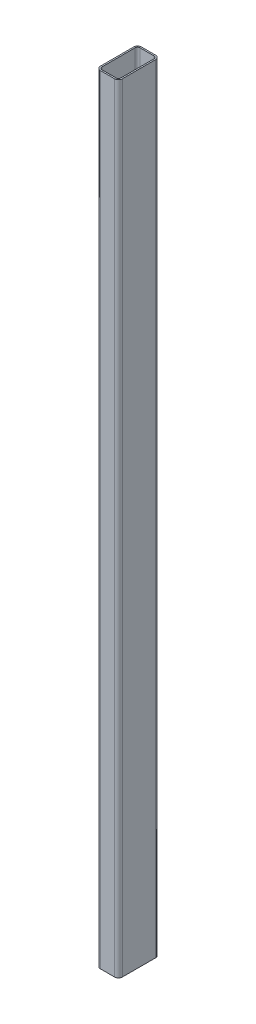
ISO-10303-21;
HEADER;
FILE_DESCRIPTION(('STEP AP214'),'2;1');
FILE_NAME('part.step','',(''),(''),'','','');
FILE_SCHEMA(('AUTOMOTIVE_DESIGN { 1 0 10303 214 1 1 1 1 }'));
ENDSEC;
DATA;
#1=APPLICATION_CONTEXT('core data for automotive mechanical design processes');
#2=APPLICATION_PROTOCOL_DEFINITION('international standard','automotive_design',2000,#1);
#3=PRODUCT_CONTEXT('',#1,'mechanical');
#4=PRODUCT('Part','Part','',(#3));
#5=PRODUCT_RELATED_PRODUCT_CATEGORY('part','',(#4));
#6=PRODUCT_DEFINITION_FORMATION('','',#4);
#7=PRODUCT_DEFINITION_CONTEXT('part definition',#1,'design');
#8=PRODUCT_DEFINITION('design','',#6,#7);
#9=PRODUCT_DEFINITION_SHAPE('','',#8);
#10=(LENGTH_UNIT() NAMED_UNIT(*) SI_UNIT(.MILLI.,.METRE.));
#11=(NAMED_UNIT(*) PLANE_ANGLE_UNIT() SI_UNIT($,.RADIAN.));
#12=(NAMED_UNIT(*) SI_UNIT($,.STERADIAN.) SOLID_ANGLE_UNIT());
#13=UNCERTAINTY_MEASURE_WITH_UNIT(LENGTH_MEASURE(1.E-05),#10,'distance_accuracy_value','');
#14=(GEOMETRIC_REPRESENTATION_CONTEXT(3) GLOBAL_UNCERTAINTY_ASSIGNED_CONTEXT((#13)) GLOBAL_UNIT_ASSIGNED_CONTEXT((#10,
#11,#12)) REPRESENTATION_CONTEXT('',''));
#15=CARTESIAN_POINT('',(0.,0.,0.));
#16=DIRECTION('',(0.,0.,1.));
#17=DIRECTION('',(1.,0.,0.));
#18=AXIS2_PLACEMENT_3D('',#15,#16,#17);
#19=CARTESIAN_POINT('',(-15.,1634.,35.));
#20=DIRECTION('',(0.,1.,0.));
#21=DIRECTION('',(0.,0.,1.));
#22=AXIS2_PLACEMENT_3D('',#19,#20,#21);
#23=PLANE('',#22);
#24=CARTESIAN_POINT('',(-15.,1634.,35.));
#25=DIRECTION('',(0.,1.,0.));
#26=DIRECTION('',(1.,0.,0.));
#27=AXIS2_PLACEMENT_3D('',#24,#25,#26);
#28=CIRCLE('',#27,8.);
#29=CARTESIAN_POINT('',(-23.,1634.,35.));
#30=VERTEX_POINT('',#29);
#31=CARTESIAN_POINT('',(-15.,1634.,43.));
#32=VERTEX_POINT('',#31);
#33=EDGE_CURVE('E261',#30,#32,#28,.T.);
#34=ORIENTED_EDGE('',*,*,#33,.T.);
#35=DIRECTION('',(1.,0.,0.));
#36=VECTOR('',#35,1.);
#37=CARTESIAN_POINT('',(-15.,1634.,43.));
#38=LINE('',#37,#36);
#39=CARTESIAN_POINT('',(15.,1634.,43.));
#40=VERTEX_POINT('',#39);
#41=EDGE_CURVE('E264',#32,#40,#38,.T.);
#42=ORIENTED_EDGE('',*,*,#41,.T.);
#43=CARTESIAN_POINT('',(15.,1634.,35.));
#44=DIRECTION('',(0.,1.,0.));
#45=DIRECTION('',(1.,0.,0.));
#46=AXIS2_PLACEMENT_3D('',#43,#44,#45);
#47=CIRCLE('',#46,8.);
#48=CARTESIAN_POINT('',(23.,1634.,34.9999999999999));
#49=VERTEX_POINT('',#48);
#50=EDGE_CURVE('E267',#40,#49,#47,.T.);
#51=ORIENTED_EDGE('',*,*,#50,.T.);
#52=DIRECTION('',(0.,0.,-1.));
#53=VECTOR('',#52,1.);
#54=CARTESIAN_POINT('',(23.,1634.,35.));
#55=LINE('',#54,#53);
#56=CARTESIAN_POINT('',(23.,1634.,-35.));
#57=VERTEX_POINT('',#56);
#58=EDGE_CURVE('E269',#49,#57,#55,.T.);
#59=ORIENTED_EDGE('',*,*,#58,.T.);
#60=CARTESIAN_POINT('',(15.,1634.,-35.));
#61=DIRECTION('',(0.,1.,0.));
#62=DIRECTION('',(1.,0.,0.));
#63=AXIS2_PLACEMENT_3D('',#60,#61,#62);
#64=CIRCLE('',#63,8.);
#65=CARTESIAN_POINT('',(14.9999999999999,1634.,-43.));
#66=VERTEX_POINT('',#65);
#67=EDGE_CURVE('E271',#57,#66,#64,.T.);
#68=ORIENTED_EDGE('',*,*,#67,.T.);
#69=DIRECTION('',(-1.,0.,0.));
#70=VECTOR('',#69,1.);
#71=CARTESIAN_POINT('',(-15.,1634.,-43.));
#72=LINE('',#71,#70);
#73=CARTESIAN_POINT('',(-15.,1634.,-43.));
#74=VERTEX_POINT('',#73);
#75=EDGE_CURVE('E273',#66,#74,#72,.T.);
#76=ORIENTED_EDGE('',*,*,#75,.T.);
#77=CARTESIAN_POINT('',(-15.,1634.,-35.));
#78=DIRECTION('',(0.,1.,0.));
#79=DIRECTION('',(1.,0.,0.));
#80=AXIS2_PLACEMENT_3D('',#77,#78,#79);
#81=CIRCLE('',#80,8.);
#82=CARTESIAN_POINT('',(-23.,1634.,-34.9999999999999));
#83=VERTEX_POINT('',#82);
#84=EDGE_CURVE('E275',#74,#83,#81,.T.);
#85=ORIENTED_EDGE('',*,*,#84,.T.);
#86=DIRECTION('',(0.,0.,1.));
#87=VECTOR('',#86,1.);
#88=CARTESIAN_POINT('',(-23.,1634.,35.));
#89=LINE('',#88,#87);
#90=EDGE_CURVE('E277',#83,#30,#89,.T.);
#91=ORIENTED_EDGE('',*,*,#90,.T.);
#92=EDGE_LOOP('',(#34,#42,#51,#59,#68,#76,#85,#91));
#93=FACE_BOUND('',#92,.T.);
#94=DIRECTION('',(1.,0.,0.));
#95=VECTOR('',#94,1.);
#96=CARTESIAN_POINT('',(-15.,1634.,40.));
#97=LINE('',#96,#95);
#98=CARTESIAN_POINT('',(-15.,1634.,40.));
#99=VERTEX_POINT('',#98);
#100=CARTESIAN_POINT('',(15.,1634.,40.));
#101=VERTEX_POINT('',#100);
#102=EDGE_CURVE('E202',#99,#101,#97,.T.);
#103=ORIENTED_EDGE('',*,*,#102,.F.);
#104=CARTESIAN_POINT('',(-15.,1634.,35.));
#105=DIRECTION('',(0.,1.,0.));
#106=DIRECTION('',(0.,0.,1.));
#107=AXIS2_PLACEMENT_3D('',#104,#105,#106);
#108=CIRCLE('',#107,5.);
#109=CARTESIAN_POINT('',(-20.,1634.,35.));
#110=VERTEX_POINT('',#109);
#111=EDGE_CURVE('E194',#110,#99,#108,.T.);
#112=ORIENTED_EDGE('',*,*,#111,.F.);
#113=DIRECTION('',(0.,0.,1.));
#114=VECTOR('',#113,1.);
#115=CARTESIAN_POINT('',(-20.,1634.,35.));
#116=LINE('',#115,#114);
#117=CARTESIAN_POINT('',(-20.,1634.,-35.));
#118=VERTEX_POINT('',#117);
#119=EDGE_CURVE('E228',#118,#110,#116,.T.);
#120=ORIENTED_EDGE('',*,*,#119,.F.);
#121=CARTESIAN_POINT('',(-15.,1634.,-35.));
#122=DIRECTION('',(0.,1.,0.));
#123=DIRECTION('',(0.,0.,1.));
#124=AXIS2_PLACEMENT_3D('',#121,#122,#123);
#125=CIRCLE('',#124,5.);
#126=CARTESIAN_POINT('',(-15.,1634.,-40.));
#127=VERTEX_POINT('',#126);
#128=EDGE_CURVE('E226',#127,#118,#125,.T.);
#129=ORIENTED_EDGE('',*,*,#128,.F.);
#130=DIRECTION('',(-1.,0.,0.));
#131=VECTOR('',#130,1.);
#132=CARTESIAN_POINT('',(-15.,1634.,-40.));
#133=LINE('',#132,#131);
#134=CARTESIAN_POINT('',(15.,1634.,-40.));
#135=VERTEX_POINT('',#134);
#136=EDGE_CURVE('E224',#135,#127,#133,.T.);
#137=ORIENTED_EDGE('',*,*,#136,.F.);
#138=CARTESIAN_POINT('',(15.,1634.,-35.));
#139=DIRECTION('',(0.,1.,0.));
#140=DIRECTION('',(0.,0.,-1.));
#141=AXIS2_PLACEMENT_3D('',#138,#139,#140);
#142=CIRCLE('',#141,5.);
#143=CARTESIAN_POINT('',(20.,1634.,-35.));
#144=VERTEX_POINT('',#143);
#145=EDGE_CURVE('E222',#144,#135,#142,.T.);
#146=ORIENTED_EDGE('',*,*,#145,.F.);
#147=DIRECTION('',(0.,0.,-1.));
#148=VECTOR('',#147,1.);
#149=CARTESIAN_POINT('',(20.,1634.,35.));
#150=LINE('',#149,#148);
#151=CARTESIAN_POINT('',(20.,1634.,35.));
#152=VERTEX_POINT('',#151);
#153=EDGE_CURVE('E217',#152,#144,#150,.T.);
#154=ORIENTED_EDGE('',*,*,#153,.F.);
#155=CARTESIAN_POINT('',(15.,1634.,35.));
#156=DIRECTION('',(0.,1.,0.));
#157=DIRECTION('',(0.,0.,1.));
#158=AXIS2_PLACEMENT_3D('',#155,#156,#157);
#159=CIRCLE('',#158,5.);
#160=EDGE_CURVE('E215',#101,#152,#159,.T.);
#161=ORIENTED_EDGE('',*,*,#160,.F.);
#162=EDGE_LOOP('',(#103,#112,#120,#129,#137,#146,#154,#161));
#163=FACE_BOUND('',#162,.T.);
#164=ADVANCED_FACE('F81',(#93,#163),#23,.T.);
#165=CARTESIAN_POINT('',(-15.,0.,35.));
#166=DIRECTION('',(0.,1.,0.));
#167=DIRECTION('',(0.,0.,1.));
#168=AXIS2_PLACEMENT_3D('',#165,#166,#167);
#169=PLANE('',#168);
#170=CARTESIAN_POINT('',(-15.,0.,35.));
#171=DIRECTION('',(0.,1.,0.));
#172=DIRECTION('',(1.,0.,0.));
#173=AXIS2_PLACEMENT_3D('',#170,#171,#172);
#174=CIRCLE('',#173,8.);
#175=CARTESIAN_POINT('',(-23.,0.,35.));
#176=VERTEX_POINT('',#175);
#177=CARTESIAN_POINT('',(-15.,0.,43.));
#178=VERTEX_POINT('',#177);
#179=EDGE_CURVE('E210',#176,#178,#174,.T.);
#180=ORIENTED_EDGE('',*,*,#179,.F.);
#181=DIRECTION('',(0.,0.,1.));
#182=VECTOR('',#181,1.);
#183=CARTESIAN_POINT('',(-23.,0.,35.));
#184=LINE('',#183,#182);
#185=CARTESIAN_POINT('',(-23.,0.,-34.9999999999999));
#186=VERTEX_POINT('',#185);
#187=EDGE_CURVE('E265',#186,#176,#184,.T.);
#188=ORIENTED_EDGE('',*,*,#187,.F.);
#189=CARTESIAN_POINT('',(-15.,0.,-35.));
#190=DIRECTION('',(0.,1.,0.));
#191=DIRECTION('',(1.,0.,0.));
#192=AXIS2_PLACEMENT_3D('',#189,#190,#191);
#193=CIRCLE('',#192,8.);
#194=CARTESIAN_POINT('',(-15.,0.,-43.));
#195=VERTEX_POINT('',#194);
#196=EDGE_CURVE('E292',#195,#186,#193,.T.);
#197=ORIENTED_EDGE('',*,*,#196,.F.);
#198=DIRECTION('',(-1.,0.,0.));
#199=VECTOR('',#198,1.);
#200=CARTESIAN_POINT('',(-15.,0.,-43.));
#201=LINE('',#200,#199);
#202=CARTESIAN_POINT('',(14.9999999999999,0.,-43.));
#203=VERTEX_POINT('',#202);
#204=EDGE_CURVE('E290',#203,#195,#201,.T.);
#205=ORIENTED_EDGE('',*,*,#204,.F.);
#206=CARTESIAN_POINT('',(15.,0.,-35.));
#207=DIRECTION('',(0.,1.,0.));
#208=DIRECTION('',(1.,0.,0.));
#209=AXIS2_PLACEMENT_3D('',#206,#207,#208);
#210=CIRCLE('',#209,8.);
#211=CARTESIAN_POINT('',(23.,0.,-35.));
#212=VERTEX_POINT('',#211);
#213=EDGE_CURVE('E288',#212,#203,#210,.T.);
#214=ORIENTED_EDGE('',*,*,#213,.F.);
#215=DIRECTION('',(0.,0.,-1.));
#216=VECTOR('',#215,1.);
#217=CARTESIAN_POINT('',(23.,0.,35.));
#218=LINE('',#217,#216);
#219=CARTESIAN_POINT('',(23.,0.,34.9999999999999));
#220=VERTEX_POINT('',#219);
#221=EDGE_CURVE('E286',#220,#212,#218,.T.);
#222=ORIENTED_EDGE('',*,*,#221,.F.);
#223=CARTESIAN_POINT('',(15.,0.,35.));
#224=DIRECTION('',(0.,1.,0.));
#225=DIRECTION('',(1.,0.,0.));
#226=AXIS2_PLACEMENT_3D('',#223,#224,#225);
#227=CIRCLE('',#226,8.);
#228=CARTESIAN_POINT('',(15.,0.,43.));
#229=VERTEX_POINT('',#228);
#230=EDGE_CURVE('E284',#229,#220,#227,.T.);
#231=ORIENTED_EDGE('',*,*,#230,.F.);
#232=DIRECTION('',(1.,0.,0.));
#233=VECTOR('',#232,1.);
#234=CARTESIAN_POINT('',(-15.,0.,43.));
#235=LINE('',#234,#233);
#236=EDGE_CURVE('E282',#178,#229,#235,.T.);
#237=ORIENTED_EDGE('',*,*,#236,.F.);
#238=EDGE_LOOP('',(#180,#188,#197,#205,#214,#222,#231,#237));
#239=FACE_BOUND('',#238,.T.);
#240=CARTESIAN_POINT('',(-15.,0.,35.));
#241=DIRECTION('',(0.,1.,0.));
#242=DIRECTION('',(0.,0.,1.));
#243=AXIS2_PLACEMENT_3D('',#240,#241,#242);
#244=CIRCLE('',#243,5.);
#245=CARTESIAN_POINT('',(-20.,0.,35.));
#246=VERTEX_POINT('',#245);
#247=CARTESIAN_POINT('',(-15.,0.,40.));
#248=VERTEX_POINT('',#247);
#249=EDGE_CURVE('E104',#246,#248,#244,.T.);
#250=ORIENTED_EDGE('',*,*,#249,.T.);
#251=DIRECTION('',(1.,0.,0.));
#252=VECTOR('',#251,1.);
#253=CARTESIAN_POINT('',(-15.,0.,40.));
#254=LINE('',#253,#252);
#255=CARTESIAN_POINT('',(15.,0.,40.));
#256=VERTEX_POINT('',#255);
#257=EDGE_CURVE('E209',#248,#256,#254,.T.);
#258=ORIENTED_EDGE('',*,*,#257,.T.);
#259=CARTESIAN_POINT('',(15.,0.,35.));
#260=DIRECTION('',(0.,1.,0.));
#261=DIRECTION('',(0.,0.,1.));
#262=AXIS2_PLACEMENT_3D('',#259,#260,#261);
#263=CIRCLE('',#262,5.);
#264=CARTESIAN_POINT('',(20.,0.,35.));
#265=VERTEX_POINT('',#264);
#266=EDGE_CURVE('E233',#256,#265,#263,.T.);
#267=ORIENTED_EDGE('',*,*,#266,.T.);
#268=DIRECTION('',(0.,0.,-1.));
#269=VECTOR('',#268,1.);
#270=CARTESIAN_POINT('',(20.,0.,35.));
#271=LINE('',#270,#269);
#272=CARTESIAN_POINT('',(20.,0.,-35.));
#273=VERTEX_POINT('',#272);
#274=EDGE_CURVE('E236',#265,#273,#271,.T.);
#275=ORIENTED_EDGE('',*,*,#274,.T.);
#276=CARTESIAN_POINT('',(15.,0.,-35.));
#277=DIRECTION('',(0.,1.,0.));
#278=DIRECTION('',(0.,0.,-1.));
#279=AXIS2_PLACEMENT_3D('',#276,#277,#278);
#280=CIRCLE('',#279,5.);
#281=CARTESIAN_POINT('',(15.,0.,-40.));
#282=VERTEX_POINT('',#281);
#283=EDGE_CURVE('E239',#273,#282,#280,.T.);
#284=ORIENTED_EDGE('',*,*,#283,.T.);
#285=DIRECTION('',(-1.,0.,0.));
#286=VECTOR('',#285,1.);
#287=CARTESIAN_POINT('',(-15.,0.,-40.));
#288=LINE('',#287,#286);
#289=CARTESIAN_POINT('',(-15.,0.,-40.));
#290=VERTEX_POINT('',#289);
#291=EDGE_CURVE('E242',#282,#290,#288,.T.);
#292=ORIENTED_EDGE('',*,*,#291,.T.);
#293=CARTESIAN_POINT('',(-15.,0.,-35.));
#294=DIRECTION('',(0.,1.,0.));
#295=DIRECTION('',(0.,0.,1.));
#296=AXIS2_PLACEMENT_3D('',#293,#294,#295);
#297=CIRCLE('',#296,5.);
#298=CARTESIAN_POINT('',(-20.,0.,-35.));
#299=VERTEX_POINT('',#298);
#300=EDGE_CURVE('E245',#290,#299,#297,.T.);
#301=ORIENTED_EDGE('',*,*,#300,.T.);
#302=DIRECTION('',(0.,0.,1.));
#303=VECTOR('',#302,1.);
#304=CARTESIAN_POINT('',(-20.,0.,35.));
#305=LINE('',#304,#303);
#306=EDGE_CURVE('E203',#299,#246,#305,.T.);
#307=ORIENTED_EDGE('',*,*,#306,.T.);
#308=EDGE_LOOP('',(#250,#258,#267,#275,#284,#292,#301,#307));
#309=FACE_BOUND('',#308,.T.);
#310=ADVANCED_FACE('F322',(#239,#309),#169,.F.);
#311=CARTESIAN_POINT('',(-15.,1634.,35.));
#312=DIRECTION('',(0.,-1.,0.));
#313=DIRECTION('',(0.,0.,-1.));
#314=AXIS2_PLACEMENT_3D('',#311,#312,#313);
#315=CYLINDRICAL_SURFACE('',#314,8.);
#316=ORIENTED_EDGE('',*,*,#179,.T.);
#317=DIRECTION('',(0.,-1.,0.));
#318=VECTOR('',#317,1.);
#319=CARTESIAN_POINT('',(-15.,1634.,43.));
#320=LINE('',#319,#318);
#321=EDGE_CURVE('E12',#32,#178,#320,.T.);
#322=ORIENTED_EDGE('',*,*,#321,.F.);
#323=ORIENTED_EDGE('',*,*,#33,.F.);
#324=DIRECTION('',(0.,-1.,0.));
#325=VECTOR('',#324,1.);
#326=CARTESIAN_POINT('',(-23.,1634.,35.));
#327=LINE('',#326,#325);
#328=EDGE_CURVE('E279',#30,#176,#327,.T.);
#329=ORIENTED_EDGE('',*,*,#328,.T.);
#330=EDGE_LOOP('',(#316,#322,#323,#329));
#331=FACE_BOUND('',#330,.T.);
#332=ADVANCED_FACE('F83',(#331),#315,.T.);
#333=CARTESIAN_POINT('',(-15.,1634.,43.));
#334=DIRECTION('',(0.,0.,-1.));
#335=DIRECTION('',(-1.,0.,0.));
#336=AXIS2_PLACEMENT_3D('',#333,#334,#335);
#337=PLANE('',#336);
#338=ORIENTED_EDGE('',*,*,#236,.T.);
#339=DIRECTION('',(0.,-1.,0.));
#340=VECTOR('',#339,1.);
#341=CARTESIAN_POINT('',(15.,1634.,43.));
#342=LINE('',#341,#340);
#343=EDGE_CURVE('E89',#40,#229,#342,.T.);
#344=ORIENTED_EDGE('',*,*,#343,.F.);
#345=ORIENTED_EDGE('',*,*,#41,.F.);
#346=ORIENTED_EDGE('',*,*,#321,.T.);
#347=EDGE_LOOP('',(#338,#344,#345,#346));
#348=FACE_BOUND('',#347,.T.);
#349=ADVANCED_FACE('F339',(#348),#337,.F.);
#350=CARTESIAN_POINT('',(15.,1634.,35.));
#351=DIRECTION('',(0.,-1.,0.));
#352=DIRECTION('',(0.,0.,-1.));
#353=AXIS2_PLACEMENT_3D('',#350,#351,#352);
#354=CYLINDRICAL_SURFACE('',#353,8.);
#355=ORIENTED_EDGE('',*,*,#230,.T.);
#356=DIRECTION('',(0.,-1.,0.));
#357=VECTOR('',#356,1.);
#358=CARTESIAN_POINT('',(23.,1634.,34.9999999999999));
#359=LINE('',#358,#357);
#360=EDGE_CURVE('E309',#49,#220,#359,.T.);
#361=ORIENTED_EDGE('',*,*,#360,.F.);
#362=ORIENTED_EDGE('',*,*,#50,.F.);
#363=ORIENTED_EDGE('',*,*,#343,.T.);
#364=EDGE_LOOP('',(#355,#361,#362,#363));
#365=FACE_BOUND('',#364,.T.);
#366=ADVANCED_FACE('F316',(#365),#354,.T.);
#367=CARTESIAN_POINT('',(23.,1634.,35.));
#368=DIRECTION('',(-1.,0.,0.));
#369=DIRECTION('',(0.,0.,1.));
#370=AXIS2_PLACEMENT_3D('',#367,#368,#369);
#371=PLANE('',#370);
#372=ORIENTED_EDGE('',*,*,#221,.T.);
#373=DIRECTION('',(0.,-1.,0.));
#374=VECTOR('',#373,1.);
#375=CARTESIAN_POINT('',(23.,1634.,-35.));
#376=LINE('',#375,#374);
#377=EDGE_CURVE('E306',#57,#212,#376,.T.);
#378=ORIENTED_EDGE('',*,*,#377,.F.);
#379=ORIENTED_EDGE('',*,*,#58,.F.);
#380=ORIENTED_EDGE('',*,*,#360,.T.);
#381=EDGE_LOOP('',(#372,#378,#379,#380));
#382=FACE_BOUND('',#381,.T.);
#383=ADVANCED_FACE('F328',(#382),#371,.F.);
#384=CARTESIAN_POINT('',(15.,1634.,-35.));
#385=DIRECTION('',(0.,-1.,0.));
#386=DIRECTION('',(0.,0.,-1.));
#387=AXIS2_PLACEMENT_3D('',#384,#385,#386);
#388=CYLINDRICAL_SURFACE('',#387,8.);
#389=ORIENTED_EDGE('',*,*,#213,.T.);
#390=DIRECTION('',(0.,-1.,0.));
#391=VECTOR('',#390,1.);
#392=CARTESIAN_POINT('',(14.9999999999999,1634.,-43.));
#393=LINE('',#392,#391);
#394=EDGE_CURVE('E303',#66,#203,#393,.T.);
#395=ORIENTED_EDGE('',*,*,#394,.F.);
#396=ORIENTED_EDGE('',*,*,#67,.F.);
#397=ORIENTED_EDGE('',*,*,#377,.T.);
#398=EDGE_LOOP('',(#389,#395,#396,#397));
#399=FACE_BOUND('',#398,.T.);
#400=ADVANCED_FACE('F332',(#399),#388,.T.);
#401=CARTESIAN_POINT('',(-15.,1634.,-43.));
#402=DIRECTION('',(0.,0.,1.));
#403=DIRECTION('',(1.,0.,0.));
#404=AXIS2_PLACEMENT_3D('',#401,#402,#403);
#405=PLANE('',#404);
#406=ORIENTED_EDGE('',*,*,#204,.T.);
#407=DIRECTION('',(0.,-1.,0.));
#408=VECTOR('',#407,1.);
#409=CARTESIAN_POINT('',(-15.,1634.,-43.));
#410=LINE('',#409,#408);
#411=EDGE_CURVE('E300',#74,#195,#410,.T.);
#412=ORIENTED_EDGE('',*,*,#411,.F.);
#413=ORIENTED_EDGE('',*,*,#75,.F.);
#414=ORIENTED_EDGE('',*,*,#394,.T.);
#415=EDGE_LOOP('',(#406,#412,#413,#414));
#416=FACE_BOUND('',#415,.T.);
#417=ADVANCED_FACE('F352',(#416),#405,.F.);
#418=CARTESIAN_POINT('',(-15.,1634.,-35.));
#419=DIRECTION('',(0.,-1.,0.));
#420=DIRECTION('',(0.,0.,-1.));
#421=AXIS2_PLACEMENT_3D('',#418,#419,#420);
#422=CYLINDRICAL_SURFACE('',#421,8.);
#423=ORIENTED_EDGE('',*,*,#196,.T.);
#424=DIRECTION('',(0.,-1.,0.));
#425=VECTOR('',#424,1.);
#426=CARTESIAN_POINT('',(-23.,1634.,-34.9999999999999));
#427=LINE('',#426,#425);
#428=EDGE_CURVE('E297',#83,#186,#427,.T.);
#429=ORIENTED_EDGE('',*,*,#428,.F.);
#430=ORIENTED_EDGE('',*,*,#84,.F.);
#431=ORIENTED_EDGE('',*,*,#411,.T.);
#432=EDGE_LOOP('',(#423,#429,#430,#431));
#433=FACE_BOUND('',#432,.T.);
#434=ADVANCED_FACE('F350',(#433),#422,.T.);
#435=CARTESIAN_POINT('',(-23.,1634.,35.));
#436=DIRECTION('',(1.,0.,0.));
#437=DIRECTION('',(0.,0.,-1.));
#438=AXIS2_PLACEMENT_3D('',#435,#436,#437);
#439=PLANE('',#438);
#440=CARTESIAN_POINT('',(-23.,35.,0.));
#441=DIRECTION('',(-1.,0.,0.));
#442=DIRECTION('',(0.,0.,1.));
#443=AXIS2_PLACEMENT_3D('',#440,#441,#442);
#444=CIRCLE('',#443,5.);
#445=CARTESIAN_POINT('',(-23.,35.,5.));
#446=VERTEX_POINT('',#445);
#447=EDGE_CURVE('E231',#446,#446,#444,.T.);
#448=ORIENTED_EDGE('',*,*,#447,.F.);
#449=EDGE_LOOP('',(#448));
#450=FACE_BOUND('',#449,.T.);
#451=CARTESIAN_POINT('',(-23.,75.,0.));
#452=DIRECTION('',(-1.,0.,0.));
#453=DIRECTION('',(0.,0.,1.));
#454=AXIS2_PLACEMENT_3D('',#451,#452,#453);
#455=CIRCLE('',#454,5.);
#456=CARTESIAN_POINT('',(-23.,75.,5.));
#457=VERTEX_POINT('',#456);
#458=EDGE_CURVE('E380',#457,#457,#455,.T.);
#459=ORIENTED_EDGE('',*,*,#458,.F.);
#460=EDGE_LOOP('',(#459));
#461=FACE_BOUND('',#460,.T.);
#462=ORIENTED_EDGE('',*,*,#187,.T.);
#463=ORIENTED_EDGE('',*,*,#328,.F.);
#464=ORIENTED_EDGE('',*,*,#90,.F.);
#465=ORIENTED_EDGE('',*,*,#428,.T.);
#466=EDGE_LOOP('',(#462,#463,#464,#465));
#467=FACE_BOUND('',#466,.T.);
#468=ADVANCED_FACE('F345',(#450,#461,#467),#439,.F.);
#469=CARTESIAN_POINT('',(-15.,1634.,35.));
#470=DIRECTION('',(0.,-1.,0.));
#471=DIRECTION('',(0.,0.,-1.));
#472=AXIS2_PLACEMENT_3D('',#469,#470,#471);
#473=CYLINDRICAL_SURFACE('',#472,5.);
#474=ORIENTED_EDGE('',*,*,#249,.F.);
#475=DIRECTION('',(0.,-1.,0.));
#476=VECTOR('',#475,1.);
#477=CARTESIAN_POINT('',(-20.,1634.,35.));
#478=LINE('',#477,#476);
#479=EDGE_CURVE('E198',#110,#246,#478,.T.);
#480=ORIENTED_EDGE('',*,*,#479,.F.);
#481=ORIENTED_EDGE('',*,*,#111,.T.);
#482=DIRECTION('',(0.,-1.,0.));
#483=VECTOR('',#482,1.);
#484=CARTESIAN_POINT('',(-15.,1634.,40.));
#485=LINE('',#484,#483);
#486=EDGE_CURVE('E197',#99,#248,#485,.T.);
#487=ORIENTED_EDGE('',*,*,#486,.T.);
#488=EDGE_LOOP('',(#474,#480,#481,#487));
#489=FACE_BOUND('',#488,.T.);
#490=ADVANCED_FACE('F196',(#489),#473,.F.);
#491=CARTESIAN_POINT('',(-15.,1634.,40.));
#492=DIRECTION('',(0.,0.,-1.));
#493=DIRECTION('',(-1.,0.,0.));
#494=AXIS2_PLACEMENT_3D('',#491,#492,#493);
#495=PLANE('',#494);
#496=ORIENTED_EDGE('',*,*,#257,.F.);
#497=ORIENTED_EDGE('',*,*,#486,.F.);
#498=ORIENTED_EDGE('',*,*,#102,.T.);
#499=DIRECTION('',(0.,-1.,0.));
#500=VECTOR('',#499,1.);
#501=CARTESIAN_POINT('',(15.,1634.,40.));
#502=LINE('',#501,#500);
#503=EDGE_CURVE('E211',#101,#256,#502,.T.);
#504=ORIENTED_EDGE('',*,*,#503,.T.);
#505=EDGE_LOOP('',(#496,#497,#498,#504));
#506=FACE_BOUND('',#505,.T.);
#507=ADVANCED_FACE('F206',(#506),#495,.T.);
#508=CARTESIAN_POINT('',(15.,1634.,35.));
#509=DIRECTION('',(0.,-1.,0.));
#510=DIRECTION('',(0.,0.,-1.));
#511=AXIS2_PLACEMENT_3D('',#508,#509,#510);
#512=CYLINDRICAL_SURFACE('',#511,5.);
#513=ORIENTED_EDGE('',*,*,#266,.F.);
#514=ORIENTED_EDGE('',*,*,#503,.F.);
#515=ORIENTED_EDGE('',*,*,#160,.T.);
#516=DIRECTION('',(0.,-1.,0.));
#517=VECTOR('',#516,1.);
#518=CARTESIAN_POINT('',(20.,1634.,35.));
#519=LINE('',#518,#517);
#520=EDGE_CURVE('E258',#152,#265,#519,.T.);
#521=ORIENTED_EDGE('',*,*,#520,.T.);
#522=EDGE_LOOP('',(#513,#514,#515,#521));
#523=FACE_BOUND('',#522,.T.);
#524=ADVANCED_FACE('F421',(#523),#512,.F.);
#525=CARTESIAN_POINT('',(20.,1634.,35.));
#526=DIRECTION('',(-1.,0.,0.));
#527=DIRECTION('',(0.,0.,1.));
#528=AXIS2_PLACEMENT_3D('',#525,#526,#527);
#529=PLANE('',#528);
#530=ORIENTED_EDGE('',*,*,#274,.F.);
#531=ORIENTED_EDGE('',*,*,#520,.F.);
#532=ORIENTED_EDGE('',*,*,#153,.T.);
#533=DIRECTION('',(0.,-1.,0.));
#534=VECTOR('',#533,1.);
#535=CARTESIAN_POINT('',(20.,1634.,-35.));
#536=LINE('',#535,#534);
#537=EDGE_CURVE('E256',#144,#273,#536,.T.);
#538=ORIENTED_EDGE('',*,*,#537,.T.);
#539=EDGE_LOOP('',(#530,#531,#532,#538));
#540=FACE_BOUND('',#539,.T.);
#541=ADVANCED_FACE('F417',(#540),#529,.T.);
#542=CARTESIAN_POINT('',(15.,1634.,-35.));
#543=DIRECTION('',(0.,-1.,0.));
#544=DIRECTION('',(0.,0.,-1.));
#545=AXIS2_PLACEMENT_3D('',#542,#543,#544);
#546=CYLINDRICAL_SURFACE('',#545,5.);
#547=ORIENTED_EDGE('',*,*,#283,.F.);
#548=ORIENTED_EDGE('',*,*,#537,.F.);
#549=ORIENTED_EDGE('',*,*,#145,.T.);
#550=DIRECTION('',(0.,-1.,0.));
#551=VECTOR('',#550,1.);
#552=CARTESIAN_POINT('',(15.,1634.,-40.));
#553=LINE('',#552,#551);
#554=EDGE_CURVE('E254',#135,#282,#553,.T.);
#555=ORIENTED_EDGE('',*,*,#554,.T.);
#556=EDGE_LOOP('',(#547,#548,#549,#555));
#557=FACE_BOUND('',#556,.T.);
#558=ADVANCED_FACE('F413',(#557),#546,.F.);
#559=CARTESIAN_POINT('',(-15.,1634.,-40.));
#560=DIRECTION('',(0.,0.,1.));
#561=DIRECTION('',(1.,0.,0.));
#562=AXIS2_PLACEMENT_3D('',#559,#560,#561);
#563=PLANE('',#562);
#564=ORIENTED_EDGE('',*,*,#291,.F.);
#565=ORIENTED_EDGE('',*,*,#554,.F.);
#566=ORIENTED_EDGE('',*,*,#136,.T.);
#567=DIRECTION('',(0.,-1.,0.));
#568=VECTOR('',#567,1.);
#569=CARTESIAN_POINT('',(-15.,1634.,-40.));
#570=LINE('',#569,#568);
#571=EDGE_CURVE('E252',#127,#290,#570,.T.);
#572=ORIENTED_EDGE('',*,*,#571,.T.);
#573=EDGE_LOOP('',(#564,#565,#566,#572));
#574=FACE_BOUND('',#573,.T.);
#575=ADVANCED_FACE('F409',(#574),#563,.T.);
#576=CARTESIAN_POINT('',(-15.,1634.,-35.));
#577=DIRECTION('',(0.,-1.,0.));
#578=DIRECTION('',(0.,0.,-1.));
#579=AXIS2_PLACEMENT_3D('',#576,#577,#578);
#580=CYLINDRICAL_SURFACE('',#579,5.);
#581=ORIENTED_EDGE('',*,*,#300,.F.);
#582=ORIENTED_EDGE('',*,*,#571,.F.);
#583=ORIENTED_EDGE('',*,*,#128,.T.);
#584=DIRECTION('',(0.,-1.,0.));
#585=VECTOR('',#584,1.);
#586=CARTESIAN_POINT('',(-20.,1634.,-35.));
#587=LINE('',#586,#585);
#588=EDGE_CURVE('E96',#118,#299,#587,.T.);
#589=ORIENTED_EDGE('',*,*,#588,.T.);
#590=EDGE_LOOP('',(#581,#582,#583,#589));
#591=FACE_BOUND('',#590,.T.);
#592=ADVANCED_FACE('F405',(#591),#580,.F.);
#593=CARTESIAN_POINT('',(-20.,1634.,35.));
#594=DIRECTION('',(1.,0.,0.));
#595=DIRECTION('',(0.,0.,-1.));
#596=AXIS2_PLACEMENT_3D('',#593,#594,#595);
#597=PLANE('',#596);
#598=CARTESIAN_POINT('',(-20.,35.,0.));
#599=DIRECTION('',(1.,0.,0.));
#600=DIRECTION('',(0.,0.,-1.));
#601=AXIS2_PLACEMENT_3D('',#598,#599,#600);
#602=CIRCLE('',#601,5.);
#603=CARTESIAN_POINT('',(-20.,35.,-5.));
#604=VERTEX_POINT('',#603);
#605=EDGE_CURVE('E382',#604,#604,#602,.F.);
#606=ORIENTED_EDGE('',*,*,#605,.T.);
#607=EDGE_LOOP('',(#606));
#608=FACE_BOUND('',#607,.T.);
#609=CARTESIAN_POINT('',(-20.,75.,0.));
#610=DIRECTION('',(1.,0.,0.));
#611=DIRECTION('',(0.,0.,-1.));
#612=AXIS2_PLACEMENT_3D('',#609,#610,#611);
#613=CIRCLE('',#612,5.);
#614=CARTESIAN_POINT('',(-20.,75.,-5.));
#615=VERTEX_POINT('',#614);
#616=EDGE_CURVE('E383',#615,#615,#613,.F.);
#617=ORIENTED_EDGE('',*,*,#616,.T.);
#618=EDGE_LOOP('',(#617));
#619=FACE_BOUND('',#618,.T.);
#620=ORIENTED_EDGE('',*,*,#306,.F.);
#621=ORIENTED_EDGE('',*,*,#588,.F.);
#622=ORIENTED_EDGE('',*,*,#119,.T.);
#623=ORIENTED_EDGE('',*,*,#479,.T.);
#624=EDGE_LOOP('',(#620,#621,#622,#623));
#625=FACE_BOUND('',#624,.T.);
#626=ADVANCED_FACE('F398',(#608,#619,#625),#597,.T.);
#627=CARTESIAN_POINT('',(23.001,75.,0.));
#628=DIRECTION('',(-1.,0.,0.));
#629=DIRECTION('',(0.,0.,1.));
#630=AXIS2_PLACEMENT_3D('',#627,#628,#629);
#631=CYLINDRICAL_SURFACE('',#630,5.);
#632=ORIENTED_EDGE('',*,*,#616,.F.);
#633=EDGE_LOOP('',(#632));
#634=FACE_BOUND('',#633,.T.);
#635=ORIENTED_EDGE('',*,*,#458,.T.);
#636=EDGE_LOOP('',(#635));
#637=FACE_BOUND('',#636,.T.);
#638=ADVANCED_FACE('F392',(#634,#637),#631,.F.);
#639=CARTESIAN_POINT('',(23.001,35.,0.));
#640=DIRECTION('',(-1.,0.,0.));
#641=DIRECTION('',(0.,0.,1.));
#642=AXIS2_PLACEMENT_3D('',#639,#640,#641);
#643=CYLINDRICAL_SURFACE('',#642,5.);
#644=ORIENTED_EDGE('',*,*,#605,.F.);
#645=EDGE_LOOP('',(#644));
#646=FACE_BOUND('',#645,.T.);
#647=ORIENTED_EDGE('',*,*,#447,.T.);
#648=EDGE_LOOP('',(#647));
#649=FACE_BOUND('',#648,.T.);
#650=ADVANCED_FACE('F390',(#646,#649),#643,.F.);
#651=CLOSED_SHELL('',(#164,#310,#332,#349,#366,#383,#400,#417,#434,#468,#490,#507,#524,#541,
#558,#575,#592,#626,#638,#650));
#652=MANIFOLD_SOLID_BREP('B2',#651);
#653=ADVANCED_BREP_SHAPE_REPRESENTATION('',(#18,#652),#14);
#654=SHAPE_DEFINITION_REPRESENTATION(#9,#653);
ENDSEC;
END-ISO-10303-21;
